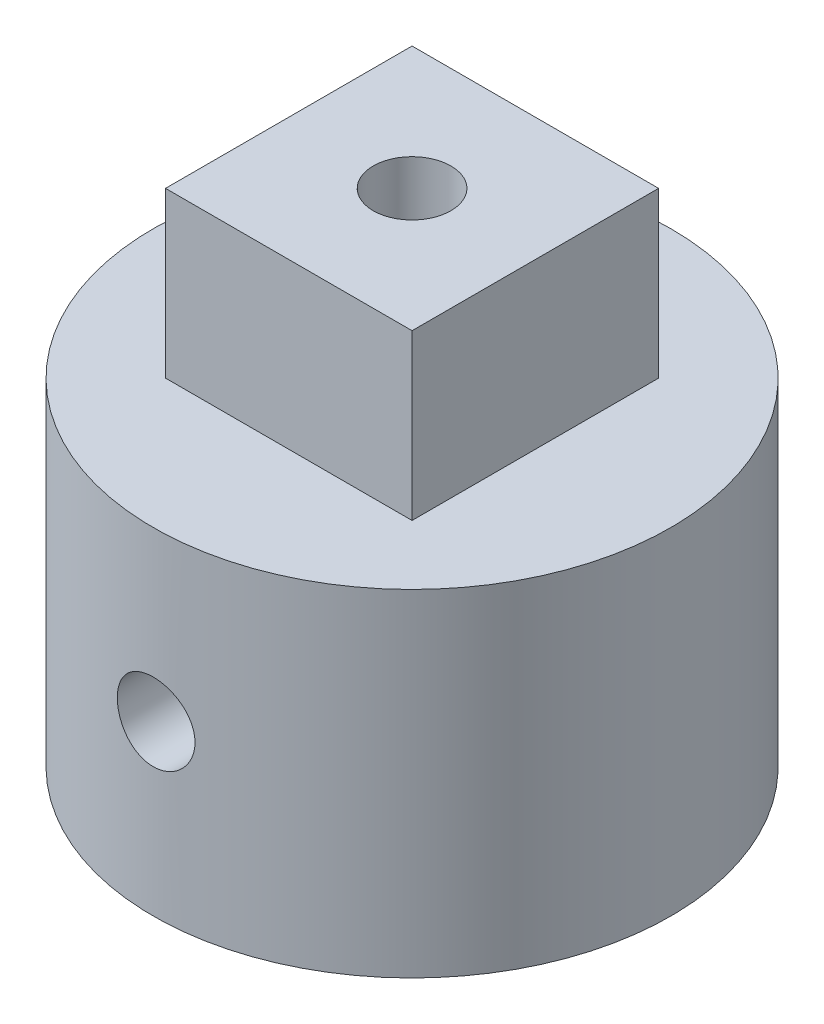
ISO-10303-21;
HEADER;
FILE_DESCRIPTION(('STEP AP214'),'2;1');
FILE_NAME('part.step','',(''),(''),'','','');
FILE_SCHEMA(('AUTOMOTIVE_DESIGN { 1 0 10303 214 1 1 1 1 }'));
ENDSEC;
DATA;
#1=APPLICATION_CONTEXT('core data for automotive mechanical design processes');
#2=APPLICATION_PROTOCOL_DEFINITION('international standard','automotive_design',2000,#1);
#3=PRODUCT_CONTEXT('',#1,'mechanical');
#4=PRODUCT('Part','Part','',(#3));
#5=PRODUCT_RELATED_PRODUCT_CATEGORY('part','',(#4));
#6=PRODUCT_DEFINITION_FORMATION('','',#4);
#7=PRODUCT_DEFINITION_CONTEXT('part definition',#1,'design');
#8=PRODUCT_DEFINITION('design','',#6,#7);
#9=PRODUCT_DEFINITION_SHAPE('','',#8);
#10=(LENGTH_UNIT() NAMED_UNIT(*) SI_UNIT(.MILLI.,.METRE.));
#11=(NAMED_UNIT(*) PLANE_ANGLE_UNIT() SI_UNIT($,.RADIAN.));
#12=(NAMED_UNIT(*) SI_UNIT($,.STERADIAN.) SOLID_ANGLE_UNIT());
#13=UNCERTAINTY_MEASURE_WITH_UNIT(LENGTH_MEASURE(1.E-05),#10,'distance_accuracy_value','');
#14=(GEOMETRIC_REPRESENTATION_CONTEXT(3) GLOBAL_UNCERTAINTY_ASSIGNED_CONTEXT((#13)) GLOBAL_UNIT_ASSIGNED_CONTEXT((#10,
#11,#12)) REPRESENTATION_CONTEXT('',''));
#15=CARTESIAN_POINT('',(0.,0.,0.));
#16=DIRECTION('',(0.,0.,1.));
#17=DIRECTION('',(1.,0.,0.));
#18=AXIS2_PLACEMENT_3D('',#15,#16,#17);
#19=CARTESIAN_POINT('',(0.,6.35,0.));
#20=DIRECTION('',(0.,-1.,0.));
#21=DIRECTION('',(0.,0.,-1.));
#22=AXIS2_PLACEMENT_3D('',#19,#20,#21);
#23=PLANE('',#22);
#24=DIRECTION('',(0.,0.,1.));
#25=VECTOR('',#24,1.);
#26=CARTESIAN_POINT('',(-4.7625,6.35,4.7625));
#27=LINE('',#26,#25);
#28=CARTESIAN_POINT('',(-4.7625,6.35,-4.7625));
#29=VERTEX_POINT('',#28);
#30=CARTESIAN_POINT('',(-4.7625,6.35,4.7625));
#31=VERTEX_POINT('',#30);
#32=EDGE_CURVE('E106',#29,#31,#27,.T.);
#33=ORIENTED_EDGE('',*,*,#32,.T.);
#34=DIRECTION('',(1.,0.,0.));
#35=VECTOR('',#34,1.);
#36=CARTESIAN_POINT('',(-4.7625,6.35,4.7625));
#37=LINE('',#36,#35);
#38=CARTESIAN_POINT('',(4.7625,6.35,4.7625));
#39=VERTEX_POINT('',#38);
#40=EDGE_CURVE('E90',#31,#39,#37,.T.);
#41=ORIENTED_EDGE('',*,*,#40,.T.);
#42=DIRECTION('',(0.,0.,-1.));
#43=VECTOR('',#42,1.);
#44=CARTESIAN_POINT('',(4.7625,6.35,4.7625));
#45=LINE('',#44,#43);
#46=CARTESIAN_POINT('',(4.7625,6.35,-4.7625));
#47=VERTEX_POINT('',#46);
#48=EDGE_CURVE('E268',#39,#47,#45,.T.);
#49=ORIENTED_EDGE('',*,*,#48,.T.);
#50=DIRECTION('',(-1.,0.,0.));
#51=VECTOR('',#50,1.);
#52=CARTESIAN_POINT('',(-4.7625,6.35,-4.7625));
#53=LINE('',#52,#51);
#54=EDGE_CURVE('E55',#47,#29,#53,.T.);
#55=ORIENTED_EDGE('',*,*,#54,.T.);
#56=EDGE_LOOP('',(#33,#41,#49,#55));
#57=FACE_BOUND('',#56,.T.);
#58=CARTESIAN_POINT('',(0.,6.35,0.));
#59=DIRECTION('',(0.,1.,0.));
#60=DIRECTION('',(0.,0.,1.));
#61=AXIS2_PLACEMENT_3D('',#58,#59,#60);
#62=CIRCLE('',#61,1.5);
#63=CARTESIAN_POINT('',(0.,6.35,1.5));
#64=VERTEX_POINT('',#63);
#65=EDGE_CURVE('E95',#64,#64,#62,.T.);
#66=ORIENTED_EDGE('',*,*,#65,.F.);
#67=EDGE_LOOP('',(#66));
#68=FACE_BOUND('',#67,.T.);
#69=ADVANCED_FACE('F33',(#57,#68),#23,.F.);
#70=CARTESIAN_POINT('',(-4.7625,6.35,4.7625));
#71=DIRECTION('',(1.,0.,0.));
#72=DIRECTION('',(0.,0.,-1.));
#73=AXIS2_PLACEMENT_3D('',#70,#71,#72);
#74=PLANE('',#73);
#75=DIRECTION('',(0.,0.,1.));
#76=VECTOR('',#75,1.);
#77=CARTESIAN_POINT('',(-4.7625,0.,4.7625));
#78=LINE('',#77,#76);
#79=CARTESIAN_POINT('',(-4.7625,0.,-4.7625));
#80=VERTEX_POINT('',#79);
#81=CARTESIAN_POINT('',(-4.7625,0.,4.7625));
#82=VERTEX_POINT('',#81);
#83=EDGE_CURVE('E80',#80,#82,#78,.T.);
#84=ORIENTED_EDGE('',*,*,#83,.T.);
#85=DIRECTION('',(0.,-1.,0.));
#86=VECTOR('',#85,1.);
#87=CARTESIAN_POINT('',(-4.7625,6.35,4.7625));
#88=LINE('',#87,#86);
#89=EDGE_CURVE('E11',#31,#82,#88,.T.);
#90=ORIENTED_EDGE('',*,*,#89,.F.);
#91=ORIENTED_EDGE('',*,*,#32,.F.);
#92=DIRECTION('',(0.,-1.,0.));
#93=VECTOR('',#92,1.);
#94=CARTESIAN_POINT('',(-4.7625,6.35,-4.7625));
#95=LINE('',#94,#93);
#96=EDGE_CURVE('E94',#29,#80,#95,.T.);
#97=ORIENTED_EDGE('',*,*,#96,.T.);
#98=EDGE_LOOP('',(#84,#90,#91,#97));
#99=FACE_BOUND('',#98,.T.);
#100=ADVANCED_FACE('F35',(#99),#74,.F.);
#101=CARTESIAN_POINT('',(-4.7625,6.35,4.7625));
#102=DIRECTION('',(0.,0.,-1.));
#103=DIRECTION('',(-1.,0.,0.));
#104=AXIS2_PLACEMENT_3D('',#101,#102,#103);
#105=PLANE('',#104);
#106=DIRECTION('',(1.,0.,0.));
#107=VECTOR('',#106,1.);
#108=CARTESIAN_POINT('',(-4.7625,0.,4.7625));
#109=LINE('',#108,#107);
#110=CARTESIAN_POINT('',(4.7625,0.,4.7625));
#111=VERTEX_POINT('',#110);
#112=EDGE_CURVE('E76',#82,#111,#109,.T.);
#113=ORIENTED_EDGE('',*,*,#112,.T.);
#114=DIRECTION('',(0.,-1.,0.));
#115=VECTOR('',#114,1.);
#116=CARTESIAN_POINT('',(4.7625,6.35,4.7625));
#117=LINE('',#116,#115);
#118=EDGE_CURVE('E47',#39,#111,#117,.T.);
#119=ORIENTED_EDGE('',*,*,#118,.F.);
#120=ORIENTED_EDGE('',*,*,#40,.F.);
#121=ORIENTED_EDGE('',*,*,#89,.T.);
#122=EDGE_LOOP('',(#113,#119,#120,#121));
#123=FACE_BOUND('',#122,.T.);
#124=ADVANCED_FACE('F89',(#123),#105,.F.);
#125=CARTESIAN_POINT('',(4.7625,6.35,4.7625));
#126=DIRECTION('',(-1.,0.,0.));
#127=DIRECTION('',(0.,0.,1.));
#128=AXIS2_PLACEMENT_3D('',#125,#126,#127);
#129=PLANE('',#128);
#130=DIRECTION('',(0.,0.,-1.));
#131=VECTOR('',#130,1.);
#132=CARTESIAN_POINT('',(4.7625,0.,4.7625));
#133=LINE('',#132,#131);
#134=CARTESIAN_POINT('',(4.7625,0.,-4.7625));
#135=VERTEX_POINT('',#134);
#136=EDGE_CURVE('E83',#111,#135,#133,.T.);
#137=ORIENTED_EDGE('',*,*,#136,.T.);
#138=DIRECTION('',(0.,-1.,0.));
#139=VECTOR('',#138,1.);
#140=CARTESIAN_POINT('',(4.7625,6.35,-4.7625));
#141=LINE('',#140,#139);
#142=EDGE_CURVE('E108',#47,#135,#141,.T.);
#143=ORIENTED_EDGE('',*,*,#142,.F.);
#144=ORIENTED_EDGE('',*,*,#48,.F.);
#145=ORIENTED_EDGE('',*,*,#118,.T.);
#146=EDGE_LOOP('',(#137,#143,#144,#145));
#147=FACE_BOUND('',#146,.T.);
#148=ADVANCED_FACE('F157',(#147),#129,.F.);
#149=CARTESIAN_POINT('',(-4.7625,6.35,-4.7625));
#150=DIRECTION('',(0.,0.,1.));
#151=DIRECTION('',(1.,0.,0.));
#152=AXIS2_PLACEMENT_3D('',#149,#150,#151);
#153=PLANE('',#152);
#154=DIRECTION('',(-1.,0.,0.));
#155=VECTOR('',#154,1.);
#156=CARTESIAN_POINT('',(-4.7625,0.,-4.7625));
#157=LINE('',#156,#155);
#158=EDGE_CURVE('E104',#135,#80,#157,.T.);
#159=ORIENTED_EDGE('',*,*,#158,.T.);
#160=ORIENTED_EDGE('',*,*,#96,.F.);
#161=ORIENTED_EDGE('',*,*,#54,.F.);
#162=ORIENTED_EDGE('',*,*,#142,.T.);
#163=EDGE_LOOP('',(#159,#160,#161,#162));
#164=FACE_BOUND('',#163,.T.);
#165=ADVANCED_FACE('F151',(#164),#153,.F.);
#166=CARTESIAN_POINT('',(0.,6.35,0.));
#167=DIRECTION('',(0.,-1.,0.));
#168=DIRECTION('',(0.,0.,-1.));
#169=AXIS2_PLACEMENT_3D('',#166,#167,#168);
#170=CYLINDRICAL_SURFACE('',#169,1.5);
#171=ORIENTED_EDGE('',*,*,#65,.T.);
#172=EDGE_LOOP('',(#171));
#173=FACE_BOUND('',#172,.T.);
#174=CARTESIAN_POINT('',(0.,0.,0.));
#175=DIRECTION('',(0.,1.,0.));
#176=DIRECTION('',(0.,0.,1.));
#177=AXIS2_PLACEMENT_3D('',#174,#175,#176);
#178=CIRCLE('',#177,1.5);
#179=CARTESIAN_POINT('',(0.,0.,1.5));
#180=VERTEX_POINT('',#179);
#181=EDGE_CURVE('E98',#180,#180,#178,.T.);
#182=ORIENTED_EDGE('',*,*,#181,.F.);
#183=EDGE_LOOP('',(#182));
#184=FACE_BOUND('',#183,.T.);
#185=ADVANCED_FACE('F147',(#173,#184),#170,.F.);
#186=CARTESIAN_POINT('',(0.,0.,0.));
#187=DIRECTION('',(0.,-1.,0.));
#188=DIRECTION('',(0.,0.,-1.));
#189=AXIS2_PLACEMENT_3D('',#186,#187,#188);
#190=PLANE('',#189);
#191=ORIENTED_EDGE('',*,*,#181,.T.);
#192=EDGE_LOOP('',(#191));
#193=FACE_BOUND('',#192,.T.);
#194=ADVANCED_FACE('F145',(#193),#190,.F.);
#195=CARTESIAN_POINT('',(0.,-13.,0.));
#196=DIRECTION('',(0.,1.,0.));
#197=DIRECTION('',(0.,0.,1.));
#198=AXIS2_PLACEMENT_3D('',#195,#196,#197);
#199=CYLINDRICAL_SURFACE('',#198,10.);
#200=CARTESIAN_POINT('',(0.,-5.,-10.));
#201=CARTESIAN_POINT('',(-0.0837515444816421,-5.00000345381524,-9.99999865771297));
#202=CARTESIAN_POINT('',(-0.167551685082132,-5.00703800084063,-9.9989368253704));
#203=CARTESIAN_POINT('',(-0.332809627994913,-5.03498319998275,-9.99480315973187));
#204=CARTESIAN_POINT('',(-0.414265068974229,-5.05590736294489,-9.99172936938473));
#205=CARTESIAN_POINT('',(-0.57241808622186,-5.11099250496762,-9.98391721219526));
#206=CARTESIAN_POINT('',(-0.649119207826799,-5.14514347950595,-9.97918010370919));
#207=CARTESIAN_POINT('',(-0.795690428635254,-5.22568837941686,-9.96856475911724));
#208=CARTESIAN_POINT('',(-0.865561474725189,-5.27208060441736,-9.96268668152773));
#209=CARTESIAN_POINT('',(-0.997046719562126,-5.37617726493987,-9.95039170991452));
#210=CARTESIAN_POINT('',(-1.0585998322255,-5.43395845620821,-9.94397133890331));
#211=CARTESIAN_POINT('',(-1.17117490668949,-5.55902768889387,-9.93134261133238));
#212=CARTESIAN_POINT('',(-1.22219626272936,-5.62631627677852,-9.92513426698505));
#213=CARTESIAN_POINT('',(-1.31249729499943,-5.76890064352249,-9.91359877458726));
#214=CARTESIAN_POINT('',(-1.35171787037205,-5.84423424698134,-9.90827611975031));
#215=CARTESIAN_POINT('',(-1.41692632171056,-6.00051282064543,-9.89916211306268));
#216=CARTESIAN_POINT('',(-1.44291491889163,-6.08145748474389,-9.89537067775449));
#217=CARTESIAN_POINT('',(-1.48073198798911,-6.24601804187172,-9.88978256218673));
#218=CARTESIAN_POINT('',(-1.49266503640518,-6.32960939340802,-9.8879711574125));
#219=CARTESIAN_POINT('',(-1.50235624033932,-6.49762616598728,-9.88650348970582));
#220=CARTESIAN_POINT('',(-1.50011520973796,-6.58205153886249,-9.88684710303147));
#221=CARTESIAN_POINT('',(-1.48160733250787,-6.74860108019414,-9.88963718352409));
#222=CARTESIAN_POINT('',(-1.4654569592775,-6.8307385264848,-9.89206618761549));
#223=CARTESIAN_POINT('',(-1.41977117403734,-6.99112436887153,-9.89872608126367));
#224=CARTESIAN_POINT('',(-1.39023538337812,-7.06937265488074,-9.90295702179379));
#225=CARTESIAN_POINT('',(-1.31849603529736,-7.22011337128286,-9.91276335545481));
#226=CARTESIAN_POINT('',(-1.27624314283198,-7.29258196909239,-9.91834396766526));
#227=CARTESIAN_POINT('',(-1.18030413128955,-7.42944459578193,-9.93021707574548));
#228=CARTESIAN_POINT('',(-1.12661726182478,-7.49383809426937,-9.93650961832501));
#229=CARTESIAN_POINT('',(-1.00869493078248,-7.61339766073972,-9.94917473056209));
#230=CARTESIAN_POINT('',(-0.944359329642001,-7.66846499028634,-9.95554747112815));
#231=CARTESIAN_POINT('',(-0.807307089894185,-7.76703593450726,-9.96759647648462));
#232=CARTESIAN_POINT('',(-0.734590414588169,-7.8105394985439,-9.9732727382251));
#233=CARTESIAN_POINT('',(-0.582754598213685,-7.88475308649955,-9.98329515585393));
#234=CARTESIAN_POINT('',(-0.503631677836778,-7.9154554918403,-9.98764051925428));
#235=CARTESIAN_POINT('',(-0.341273182487058,-7.96310938968538,-9.99450490557069));
#236=CARTESIAN_POINT('',(-0.258037885952598,-7.98006181181558,-9.99702405195467));
#237=CARTESIAN_POINT('',(-0.090669567643644,-7.9996032298167,-9.99993581133871));
#238=CARTESIAN_POINT('',(-0.00655273187046784,-8.00232797137932,-10.0003485209039));
#239=CARTESIAN_POINT('',(0.160936677662285,-7.99369699468898,-9.99905561015226));
#240=CARTESIAN_POINT('',(0.244309274381879,-7.9823417123319,-9.99735005541369));
#241=CARTESIAN_POINT('',(0.407532387431411,-7.94598589982246,-9.99202468615333));
#242=CARTESIAN_POINT('',(0.487397963079841,-7.92105150396915,-9.98841415207984));
#243=CARTESIAN_POINT('',(0.641814958643002,-7.85831500253824,-9.97968235658369));
#244=CARTESIAN_POINT('',(0.716366128795103,-7.82051229266637,-9.97456102421565));
#245=CARTESIAN_POINT('',(0.858634979291923,-7.73279377543614,-9.96332682468686));
#246=CARTESIAN_POINT('',(0.926299009891568,-7.68279185998723,-9.95720701626745));
#247=CARTESIAN_POINT('',(1.05232367317771,-7.57221418837125,-9.94467863012165));
#248=CARTESIAN_POINT('',(1.11068376479341,-7.51163781767535,-9.93827003562867));
#249=CARTESIAN_POINT('',(1.21693784957196,-7.38102646682351,-9.92582264304494));
#250=CARTESIAN_POINT('',(1.26474084747421,-7.31091707480523,-9.91978736017588));
#251=CARTESIAN_POINT('',(1.34789129270584,-7.16358395948823,-9.90883219104903));
#252=CARTESIAN_POINT('',(1.38323907656436,-7.08636042847853,-9.90391227465628));
#253=CARTESIAN_POINT('',(1.44033467323944,-6.92726246637687,-9.89577033008645));
#254=CARTESIAN_POINT('',(1.46213037141636,-6.84540553902875,-9.89254233006438));
#255=CARTESIAN_POINT('',(1.49165549501587,-6.67914098456489,-9.88813382297802));
#256=CARTESIAN_POINT('',(1.49938589183067,-6.59473353400532,-9.88695317451771));
#257=CARTESIAN_POINT('',(1.5005378666944,-6.42667093668422,-9.88677832610841));
#258=CARTESIAN_POINT('',(1.49410252167313,-6.34301675824307,-9.88776226333502));
#259=CARTESIAN_POINT('',(1.46741229544379,-6.17799473667648,-9.89175820611174));
#260=CARTESIAN_POINT('',(1.44715743638627,-6.0966268898866,-9.89477020841118));
#261=CARTESIAN_POINT('',(1.39345373518665,-5.93852691776567,-9.90247526112297));
#262=CARTESIAN_POINT('',(1.36001489324314,-5.86179132956656,-9.90716703716075));
#263=CARTESIAN_POINT('',(1.28090667642309,-5.7149963661976,-9.91770454557702));
#264=CARTESIAN_POINT('',(1.23523688741502,-5.64493721719635,-9.92355031702724));
#265=CARTESIAN_POINT('',(1.13244337659164,-5.51275694202483,-9.93580743364938));
#266=CARTESIAN_POINT('',(1.07521369039806,-5.45071866675293,-9.94222367881967));
#267=CARTESIAN_POINT('',(0.951148841082834,-5.33707544521217,-9.95485788826636));
#268=CARTESIAN_POINT('',(0.884311448350941,-5.28547292742384,-9.96107580610759));
#269=CARTESIAN_POINT('',(0.742495707543722,-5.19391232339263,-9.9726518579052));
#270=CARTESIAN_POINT('',(0.66747457676476,-5.15401989078525,-9.9780050712882));
#271=CARTESIAN_POINT('',(0.511751870248719,-5.08746148324195,-9.98720028802959));
#272=CARTESIAN_POINT('',(0.431056277096704,-5.06078180994631,-9.99104385565757));
#273=CARTESIAN_POINT('',(0.291665727889329,-5.02745865728989,-9.99590939261505));
#274=CARTESIAN_POINT('',(0.233831133495278,-5.01717739846119,-9.99743549179557));
#275=CARTESIAN_POINT('',(0.117338971600125,-5.00344690228736,-9.99948125947896));
#276=CARTESIAN_POINT('',(0.0586814143344172,-4.99999758004745,-10.0000009404877));
#277=CARTESIAN_POINT('',(0.,-5.,-10.));
#278=B_SPLINE_CURVE_WITH_KNOTS('',3,(#200,#201,#202,#203,#204,#205,#206,#207,#208,#209,#210,
#211,#212,#213,#214,#215,#216,#217,#218,#219,#220,#221,#222,#223,#224,#225,#226,#227,#228,#229,
#230,#231,#232,#233,#234,#235,#236,#237,#238,#239,#240,#241,#242,#243,#244,#245,#246,#247,#248,
#249,#250,#251,#252,#253,#254,#255,#256,#257,#258,#259,#260,#261,#262,#263,#264,#265,#266,#267,
#268,#269,#270,#271,#272,#273,#274,#275,#276,#277),.UNSPECIFIED.,.T.,.F.,(4,2,2,2,2,2,2,2,2,2,2,
2,2,2,2,2,2,2,2,2,2,2,2,2,2,2,2,2,2,2,2,2,2,2,2,2,2,2,4),(0.,0.251040205031663,0.50232496292915,
0.753420023583237,1.0044802241976,1.25729416136843,1.5101226357258,1.76419702395375,
2.01825756225506,2.27041564605924,2.52255925098982,2.77261177195746,3.02267136690361,
3.27371383476159,3.52477278308534,3.77834291255409,4.03191415238668,4.28563608984875,
4.53934087193401,4.79062058544255,5.04189251991155,5.29195148965948,5.54202220376274,
5.79391188036908,6.0458162002863,6.29981366584672,6.55380426808833,6.80689223457169,
7.05996272137177,7.31048888261065,7.56101464229564,7.81135073984147,8.0616953146688,
8.31444829965721,8.56726003468733,8.82146323384734,9.07540233261442,9.25129851978809,
9.42719252123291),.UNSPECIFIED.);
#279=CARTESIAN_POINT('',(0.,-5.,-10.));
#280=VERTEX_POINT('',#279);
#281=EDGE_CURVE('E130',#280,#280,#278,.T.);
#282=ORIENTED_EDGE('',*,*,#281,.T.);
#283=EDGE_LOOP('',(#282));
#284=FACE_BOUND('',#283,.T.);
#285=CARTESIAN_POINT('',(0.,-8.,10.));
#286=CARTESIAN_POINT('',(-0.0837515444816422,-7.99999654618476,9.99999865771297));
#287=CARTESIAN_POINT('',(-0.167551685082132,-7.99296199915937,9.9989368253704));
#288=CARTESIAN_POINT('',(-0.332809627994913,-7.96501680001725,9.99480315973187));
#289=CARTESIAN_POINT('',(-0.414265068974229,-7.94409263705511,9.99172936938473));
#290=CARTESIAN_POINT('',(-0.57241808622186,-7.88900749503237,9.98391721219526));
#291=CARTESIAN_POINT('',(-0.649119207826799,-7.85485652049405,9.97918010370919));
#292=CARTESIAN_POINT('',(-0.795690428635254,-7.77431162058314,9.96856475911724));
#293=CARTESIAN_POINT('',(-0.865561474725189,-7.72791939558264,9.96268668152773));
#294=CARTESIAN_POINT('',(-0.997046719562126,-7.62382273506013,9.95039170991452));
#295=CARTESIAN_POINT('',(-1.0585998322255,-7.56604154379179,9.94397133890331));
#296=CARTESIAN_POINT('',(-1.17117490668948,-7.44097231110613,9.93134261133238));
#297=CARTESIAN_POINT('',(-1.22219626272936,-7.37368372322148,9.92513426698505));
#298=CARTESIAN_POINT('',(-1.31249729499943,-7.23109935647751,9.91359877458726));
#299=CARTESIAN_POINT('',(-1.35171787037205,-7.15576575301866,9.90827611975031));
#300=CARTESIAN_POINT('',(-1.41692632171056,-6.99948717935457,9.89916211306268));
#301=CARTESIAN_POINT('',(-1.44291491889163,-6.91854251525611,9.89537067775449));
#302=CARTESIAN_POINT('',(-1.48073198798911,-6.75398195812828,9.88978256218673));
#303=CARTESIAN_POINT('',(-1.49266503640518,-6.67039060659198,9.8879711574125));
#304=CARTESIAN_POINT('',(-1.50235624033932,-6.50237383401272,9.88650348970582));
#305=CARTESIAN_POINT('',(-1.50011520973796,-6.41794846113751,9.88684710303147));
#306=CARTESIAN_POINT('',(-1.48160733250787,-6.25139891980586,9.88963718352409));
#307=CARTESIAN_POINT('',(-1.4654569592775,-6.1692614735152,9.89206618761549));
#308=CARTESIAN_POINT('',(-1.41977117403734,-6.00887563112847,9.89872608126367));
#309=CARTESIAN_POINT('',(-1.39023538337812,-5.93062734511925,9.90295702179379));
#310=CARTESIAN_POINT('',(-1.31849603529736,-5.77988662871714,9.91276335545481));
#311=CARTESIAN_POINT('',(-1.27624314283198,-5.70741803090761,9.91834396766526));
#312=CARTESIAN_POINT('',(-1.18030413128955,-5.57055540421807,9.93021707574548));
#313=CARTESIAN_POINT('',(-1.12661726182478,-5.50616190573063,9.93650961832501));
#314=CARTESIAN_POINT('',(-1.00869493078248,-5.38660233926028,9.94917473056209));
#315=CARTESIAN_POINT('',(-0.944359329642001,-5.33153500971366,9.95554747112815));
#316=CARTESIAN_POINT('',(-0.807307089894186,-5.23296406549274,9.96759647648462));
#317=CARTESIAN_POINT('',(-0.73459041458817,-5.1894605014561,9.9732727382251));
#318=CARTESIAN_POINT('',(-0.582754598213685,-5.11524691350045,9.98329515585393));
#319=CARTESIAN_POINT('',(-0.503631677836779,-5.0845445081597,9.98764051925428));
#320=CARTESIAN_POINT('',(-0.341273182487059,-5.03689061031463,9.99450490557069));
#321=CARTESIAN_POINT('',(-0.258037885952599,-5.01993818818442,9.99702405195467));
#322=CARTESIAN_POINT('',(-0.0906695676436446,-5.0003967701833,9.99993581133871));
#323=CARTESIAN_POINT('',(-0.00655273187046838,-4.99767202862068,10.0003485209039));
#324=CARTESIAN_POINT('',(0.160936677662285,-5.00630300531102,9.99905561015226));
#325=CARTESIAN_POINT('',(0.244309274381879,-5.0176582876681,9.99735005541368));
#326=CARTESIAN_POINT('',(0.40753238743141,-5.05401410017754,9.99202468615333));
#327=CARTESIAN_POINT('',(0.48739796307984,-5.07894849603084,9.98841415207984));
#328=CARTESIAN_POINT('',(0.641814958643001,-5.14168499746176,9.97968235658369));
#329=CARTESIAN_POINT('',(0.716366128795101,-5.17948770733363,9.97456102421565));
#330=CARTESIAN_POINT('',(0.858634979291923,-5.26720622456386,9.96332682468686));
#331=CARTESIAN_POINT('',(0.926299009891568,-5.31720814001277,9.95720701626745));
#332=CARTESIAN_POINT('',(1.05232367317771,-5.42778581162875,9.94467863012165));
#333=CARTESIAN_POINT('',(1.1106837647934,-5.48836218232465,9.93827003562867));
#334=CARTESIAN_POINT('',(1.21693784957196,-5.61897353317649,9.92582264304494));
#335=CARTESIAN_POINT('',(1.26474084747421,-5.68908292519477,9.91978736017588));
#336=CARTESIAN_POINT('',(1.34789129270584,-5.83641604051177,9.90883219104903));
#337=CARTESIAN_POINT('',(1.38323907656436,-5.91363957152147,9.90391227465628));
#338=CARTESIAN_POINT('',(1.44033467323944,-6.07273753362313,9.89577033008645));
#339=CARTESIAN_POINT('',(1.46213037141636,-6.15459446097124,9.89254233006438));
#340=CARTESIAN_POINT('',(1.49165549501587,-6.32085901543511,9.88813382297802));
#341=CARTESIAN_POINT('',(1.49938589183067,-6.40526646599468,9.88695317451771));
#342=CARTESIAN_POINT('',(1.5005378666944,-6.57332906331578,9.88677832610841));
#343=CARTESIAN_POINT('',(1.49410252167313,-6.65698324175692,9.88776226333502));
#344=CARTESIAN_POINT('',(1.46741229544379,-6.82200526332352,9.89175820611174));
#345=CARTESIAN_POINT('',(1.44715743638627,-6.90337311011339,9.89477020841117));
#346=CARTESIAN_POINT('',(1.39345373518665,-7.06147308223432,9.90247526112297));
#347=CARTESIAN_POINT('',(1.36001489324314,-7.13820867043344,9.90716703716075));
#348=CARTESIAN_POINT('',(1.28090667642309,-7.2850036338024,9.91770454557702));
#349=CARTESIAN_POINT('',(1.23523688741502,-7.35506278280364,9.92355031702724));
#350=CARTESIAN_POINT('',(1.13244337659164,-7.48724305797517,9.93580743364938));
#351=CARTESIAN_POINT('',(1.07521369039806,-7.54928133324707,9.94222367881967));
#352=CARTESIAN_POINT('',(0.951148841082836,-7.66292455478782,9.95485788826636));
#353=CARTESIAN_POINT('',(0.884311448350942,-7.71452707257616,9.96107580610759));
#354=CARTESIAN_POINT('',(0.742495707543722,-7.80608767660736,9.9726518579052));
#355=CARTESIAN_POINT('',(0.667474576764761,-7.84598010921475,9.9780050712882));
#356=CARTESIAN_POINT('',(0.51175187024872,-7.91253851675804,9.98720028802959));
#357=CARTESIAN_POINT('',(0.431056277096705,-7.93921819005369,9.99104385565757));
#358=CARTESIAN_POINT('',(0.29166572788933,-7.97254134271011,9.99590939261505));
#359=CARTESIAN_POINT('',(0.233831133495279,-7.98282260153881,9.99743549179557));
#360=CARTESIAN_POINT('',(0.117338971600125,-7.99655309771264,9.99948125947896));
#361=CARTESIAN_POINT('',(0.0586814143344171,-8.00000241995255,10.0000009404877));
#362=CARTESIAN_POINT('',(0.,-8.,10.));
#363=B_SPLINE_CURVE_WITH_KNOTS('',3,(#285,#286,#287,#288,#289,#290,#291,#292,#293,#294,#295,
#296,#297,#298,#299,#300,#301,#302,#303,#304,#305,#306,#307,#308,#309,#310,#311,#312,#313,#314,
#315,#316,#317,#318,#319,#320,#321,#322,#323,#324,#325,#326,#327,#328,#329,#330,#331,#332,#333,
#334,#335,#336,#337,#338,#339,#340,#341,#342,#343,#344,#345,#346,#347,#348,#349,#350,#351,#352,
#353,#354,#355,#356,#357,#358,#359,#360,#361,#362),.UNSPECIFIED.,.T.,.F.,(4,2,2,2,2,2,2,2,2,2,2,
2,2,2,2,2,2,2,2,2,2,2,2,2,2,2,2,2,2,2,2,2,2,2,2,2,2,2,4),(0.,0.251040205031663,
0.502324962929151,0.753420023583238,1.0044802241976,1.25729416136843,1.5101226357258,
1.76419702395375,2.01825756225506,2.27041564605924,2.52255925098982,2.77261177195746,
3.02267136690361,3.27371383476159,3.52477278308534,3.77834291255409,4.03191415238668,
4.28563608984874,4.53934087193401,4.79062058544255,5.04189251991155,5.29195148965948,
5.54202220376274,5.79391188036908,6.0458162002863,6.29981366584672,6.55380426808832,
6.80689223457168,7.05996272137177,7.31048888261064,7.56101464229564,7.81135073984147,
8.0616953146688,8.31444829965721,8.56726003468733,8.82146323384734,9.07540233261442,
9.25129851978809,9.42719252123291),.UNSPECIFIED.);
#364=CARTESIAN_POINT('',(0.,-8.,10.));
#365=VERTEX_POINT('',#364);
#366=EDGE_CURVE('E135',#365,#365,#363,.T.);
#367=ORIENTED_EDGE('',*,*,#366,.T.);
#368=EDGE_LOOP('',(#367));
#369=FACE_BOUND('',#368,.T.);
#370=CARTESIAN_POINT('',(0.,-13.,0.));
#371=DIRECTION('',(0.,-1.,0.));
#372=DIRECTION('',(0.,0.,-1.));
#373=AXIS2_PLACEMENT_3D('',#370,#371,#372);
#374=CIRCLE('',#373,10.);
#375=CARTESIAN_POINT('',(0.,-13.,-10.));
#376=VERTEX_POINT('',#375);
#377=EDGE_CURVE('E254',#376,#376,#374,.T.);
#378=ORIENTED_EDGE('',*,*,#377,.F.);
#379=EDGE_LOOP('',(#378));
#380=FACE_BOUND('',#379,.T.);
#381=CARTESIAN_POINT('',(0.,0.,0.));
#382=DIRECTION('',(0.,-1.,0.));
#383=DIRECTION('',(0.,0.,-1.));
#384=AXIS2_PLACEMENT_3D('',#381,#382,#383);
#385=CIRCLE('',#384,10.);
#386=CARTESIAN_POINT('',(0.,0.,-10.));
#387=VERTEX_POINT('',#386);
#388=EDGE_CURVE('E257',#387,#387,#385,.T.);
#389=ORIENTED_EDGE('',*,*,#388,.T.);
#390=EDGE_LOOP('',(#389));
#391=FACE_BOUND('',#390,.T.);
#392=ADVANCED_FACE('F139',(#284,#369,#380,#391),#199,.T.);
#393=CARTESIAN_POINT('',(0.,-13.,0.));
#394=DIRECTION('',(0.,-1.,0.));
#395=DIRECTION('',(0.,0.,-1.));
#396=AXIS2_PLACEMENT_3D('',#393,#394,#395);
#397=PLANE('',#396);
#398=CARTESIAN_POINT('',(0.,-13.,0.));
#399=DIRECTION('',(0.,-1.,0.));
#400=DIRECTION('',(0.,0.,-1.));
#401=AXIS2_PLACEMENT_3D('',#398,#399,#400);
#402=CIRCLE('',#401,1.55);
#403=CARTESIAN_POINT('',(0.,-13.,-1.55));
#404=VERTEX_POINT('',#403);
#405=EDGE_CURVE('E262',#404,#404,#402,.T.);
#406=ORIENTED_EDGE('',*,*,#405,.F.);
#407=EDGE_LOOP('',(#406));
#408=FACE_BOUND('',#407,.T.);
#409=ORIENTED_EDGE('',*,*,#377,.T.);
#410=EDGE_LOOP('',(#409));
#411=FACE_BOUND('',#410,.T.);
#412=ADVANCED_FACE('F144',(#408,#411),#397,.T.);
#413=ORIENTED_EDGE('',*,*,#83,.F.);
#414=ORIENTED_EDGE('',*,*,#158,.F.);
#415=ORIENTED_EDGE('',*,*,#136,.F.);
#416=ORIENTED_EDGE('',*,*,#112,.F.);
#417=EDGE_LOOP('',(#413,#414,#415,#416));
#418=FACE_BOUND('',#417,.T.);
#419=ORIENTED_EDGE('',*,*,#388,.F.);
#420=EDGE_LOOP('',(#419));
#421=FACE_BOUND('',#420,.T.);
#422=ADVANCED_FACE('F77',(#418,#421),#190,.F.);
#423=CARTESIAN_POINT('',(0.,-2.,0.));
#424=DIRECTION('',(0.,-1.,0.));
#425=DIRECTION('',(0.,0.,-1.));
#426=AXIS2_PLACEMENT_3D('',#423,#424,#425);
#427=CYLINDRICAL_SURFACE('',#426,1.55);
#428=CARTESIAN_POINT('',(0.,-5.,-1.55));
#429=CARTESIAN_POINT('',(0.0676355330274348,-5.00000923631241,-1.54999081843046));
#430=CARTESIAN_POINT('',(0.135385038064903,-5.00462037293084,-1.54552730815956));
#431=CARTESIAN_POINT('',(0.268656128092146,-5.02271232440576,-1.52802940917958));
#432=CARTESIAN_POINT('',(0.334170585245085,-5.03621914983451,-1.51496988620329));
#433=CARTESIAN_POINT('',(0.460531661005092,-5.07095376198101,-1.48143605448111));
#434=CARTESIAN_POINT('',(0.521408709249813,-5.09212479487793,-1.46101625363012));
#435=CARTESIAN_POINT('',(0.63788889208984,-5.14092217538052,-1.41405401872415));
#436=CARTESIAN_POINT('',(0.693492939511153,-5.16854740280145,-1.38751264713421));
#437=CARTESIAN_POINT('',(0.820581634788787,-5.24143387455275,-1.31770149581901));
#438=CARTESIAN_POINT('',(0.88925641215993,-5.28928648135122,-1.27203025962067));
#439=CARTESIAN_POINT('',(1.01520576989899,-5.3927350980075,-1.17399180153673));
#440=CARTESIAN_POINT('',(1.07244587684376,-5.44835368939543,-1.12160509050306));
#441=CARTESIAN_POINT('',(1.15905645809111,-5.54639272054253,-1.03036877243889));
#442=CARTESIAN_POINT('',(1.19144642006318,-5.58724718970326,-0.992635667006654));
#443=CARTESIAN_POINT('',(1.25138700905586,-5.67132671585276,-0.915914787426986));
#444=CARTESIAN_POINT('',(1.27893455042558,-5.71455326150726,-0.876926231875601));
#445=CARTESIAN_POINT('',(1.32929209619449,-5.80316681779822,-0.798530053193023));
#446=CARTESIAN_POINT('',(1.35210921725435,-5.84855045487485,-0.759123154727602));
#447=CARTESIAN_POINT('',(1.393168512786,-5.94171809874191,-0.68082483303168));
#448=CARTESIAN_POINT('',(1.41141486057361,-5.98949986772287,-0.641932970513512));
#449=CARTESIAN_POINT('',(1.43796585474672,-6.07170374770097,-0.579220247170034));
#450=CARTESIAN_POINT('',(1.44754930690894,-6.10520691718932,-0.554734187823027));
#451=CARTESIAN_POINT('',(1.46463329583353,-6.17424295541027,-0.507900505941639));
#452=CARTESIAN_POINT('',(1.4721343935952,-6.20977527436097,-0.485552308519334));
#453=CARTESIAN_POINT('',(1.48283152463227,-6.27223429469908,-0.451580002246387));
#454=CARTESIAN_POINT('',(1.48664094036618,-6.29840141144391,-0.438782056021786));
#455=CARTESIAN_POINT('',(1.4929607756499,-6.35235133739796,-0.416772507905549));
#456=CARTESIAN_POINT('',(1.49547530893552,-6.38012871409657,-0.407549571880431));
#457=CARTESIAN_POINT('',(1.49854011071256,-6.43035112943046,-0.396112814231927));
#458=CARTESIAN_POINT('',(1.49941413846041,-6.45250508240597,-0.392757694838758));
#459=CARTESIAN_POINT('',(1.50016193526527,-6.49706295639663,-0.389893808440603));
#460=CARTESIAN_POINT('',(1.50003712302609,-6.51946647775493,-0.390379586000368));
#461=CARTESIAN_POINT('',(1.4988087528499,-6.56374051964912,-0.395065145411762));
#462=CARTESIAN_POINT('',(1.49770901081175,-6.58561277699402,-0.399250447051158));
#463=CARTESIAN_POINT('',(1.49463886434278,-6.6285231506924,-0.410597810421202));
#464=CARTESIAN_POINT('',(1.49266644232335,-6.64955921025295,-0.417766767909633));
#465=CARTESIAN_POINT('',(1.48421675577554,-6.72365798180155,-0.447289588755));
#466=CARTESIAN_POINT('',(1.4755864871079,-6.77400681899034,-0.475563845772818));
#467=CARTESIAN_POINT('',(1.45432019738923,-6.87070001300169,-0.537178739458943));
#468=CARTESIAN_POINT('',(1.44164953074072,-6.91700515103195,-0.570561845752363));
#469=CARTESIAN_POINT('',(1.41119167479362,-7.01106464763118,-0.642413158273158));
#470=CARTESIAN_POINT('',(1.39304229169765,-7.05856364542074,-0.681067117658293));
#471=CARTESIAN_POINT('',(1.3522289371783,-7.1511825589628,-0.758893263977797));
#472=CARTESIAN_POINT('',(1.32956049851528,-7.1963000642633,-0.798065927609309));
#473=CARTESIAN_POINT('',(1.27968080639221,-7.28419305029614,-0.875809766059654));
#474=CARTESIAN_POINT('',(1.25248535967425,-7.32697601528059,-0.914382540158556));
#475=CARTESIAN_POINT('',(1.1933570727096,-7.41022138268253,-0.990310294747434));
#476=CARTESIAN_POINT('',(1.16142733296676,-7.45068527999665,-1.02766605288113));
#477=CARTESIAN_POINT('',(1.07706051760184,-7.54674557237138,-1.11702184078188));
#478=CARTESIAN_POINT('',(1.02187542128093,-7.60092025676001,-1.16801390921706));
#479=CARTESIAN_POINT('',(0.900638243110883,-7.70210845619782,-1.26384571665306));
#480=CARTESIAN_POINT('',(0.834600360521077,-7.74913117576793,-1.30869335597762));
#481=CARTESIAN_POINT('',(0.70736474432969,-7.82432447255156,-1.38066834191322));
#482=CARTESIAN_POINT('',(0.648265804662634,-7.85436901934158,-1.40952616528862));
#483=CARTESIAN_POINT('',(0.524040425774721,-7.90709764053349,-1.46026443944318));
#484=CARTESIAN_POINT('',(0.458917640809063,-7.92978614019492,-1.48214908501786));
#485=CARTESIAN_POINT('',(0.323357261638128,-7.96642625354188,-1.5175252684446));
#486=CARTESIAN_POINT('',(0.252877834811486,-7.98029899450934,-1.53094103013228));
#487=CARTESIAN_POINT('',(0.109496119878127,-7.99773477723689,-1.54780630384202));
#488=CARTESIAN_POINT('',(0.0365960895639668,-8.00130716766464,-1.55126485309303));
#489=CARTESIAN_POINT('',(-0.0984919810263457,-7.99807077570085,-1.5481331430729));
#490=CARTESIAN_POINT('',(-0.160752682035299,-7.99264357327161,-1.54288022059812));
#491=CARTESIAN_POINT('',(-0.283103371878402,-7.9743400470884,-1.52517972072979));
#492=CARTESIAN_POINT('',(-0.343193125040603,-7.96146291715755,-1.51273136469899));
#493=CARTESIAN_POINT('',(-0.45988348607445,-7.92905052963417,-1.48144097259974));
#494=CARTESIAN_POINT('',(-0.516477558519089,-7.90950322161571,-1.46258736499715));
#495=CARTESIAN_POINT('',(-0.625185056628186,-7.86477262584326,-1.41953103602407));
#496=CARTESIAN_POINT('',(-0.677296955637226,-7.83958742823014,-1.39532650203913));
#497=CARTESIAN_POINT('',(-0.80114301695238,-7.77096788234546,-1.32955531942303));
#498=CARTESIAN_POINT('',(-0.869873446620261,-7.7246603802874,-1.28531444673555));
#499=CARTESIAN_POINT('',(-0.996221572518751,-7.62431589332919,-1.19010260703674));
#500=CARTESIAN_POINT('',(-1.05380501309096,-7.57025594356352,-1.1391116803163));
#501=CARTESIAN_POINT('',(-1.17684019417416,-7.43598313372513,-1.01377239339766));
#502=CARTESIAN_POINT('',(-1.23776700867064,-7.35332168415441,-0.937582193271948));
#503=CARTESIAN_POINT('',(-1.31518074653591,-7.22307629172385,-0.821565625582551));
#504=CARTESIAN_POINT('',(-1.33865419259973,-7.17862391890859,-0.782609044063352));
#505=CARTESIAN_POINT('',(-1.38111453148267,-7.08741639573558,-0.70495880575151));
#506=CARTESIAN_POINT('',(-1.40010488794505,-7.0406630570831,-0.666264968560315));
#507=CARTESIAN_POINT('',(-1.42865852656185,-6.95850086290446,-0.601900746736151));
#508=CARTESIAN_POINT('',(-1.43934747871828,-6.92383831429716,-0.575770422288701));
#509=CARTESIAN_POINT('',(-1.45846916957239,-6.85247262453873,-0.525437401582552));
#510=CARTESIAN_POINT('',(-1.46690169224685,-6.8157692884152,-0.501234890042072));
#511=CARTESIAN_POINT('',(-1.47915836826865,-6.75067792175218,-0.463531921663719));
#512=CARTESIAN_POINT('',(-1.48360817410217,-6.72303011650118,-0.448980349699609));
#513=CARTESIAN_POINT('',(-1.49107253782405,-6.66591035750205,-0.423530203157782));
#514=CARTESIAN_POINT('',(-1.4940916438818,-6.63644452548262,-0.412620085612804));
#515=CARTESIAN_POINT('',(-1.49778533654472,-6.58434296133269,-0.398968516937335));
#516=CARTESIAN_POINT('',(-1.49888133135799,-6.56212966787336,-0.394790034674023));
#517=CARTESIAN_POINT('',(-1.50006670712492,-6.51731006984792,-0.39026452270364));
#518=CARTESIAN_POINT('',(-1.50015818188905,-6.494704681172,-0.389909523400764));
#519=CARTESIAN_POINT('',(-1.49932930092276,-6.44984410921594,-0.393081437578552));
#520=CARTESIAN_POINT('',(-1.4984106800186,-6.42758839187338,-0.396601695367214));
#521=CARTESIAN_POINT('',(-1.49565869150687,-6.38386823273076,-0.406858697023164));
#522=CARTESIAN_POINT('',(-1.49382290141957,-6.36240604895085,-0.413603956910124));
#523=CARTESIAN_POINT('',(-1.48628457398181,-6.29143243946482,-0.440249186294603));
#524=CARTESIAN_POINT('',(-1.47874616727958,-6.24419352382105,-0.465438051484506));
#525=CARTESIAN_POINT('',(-1.46016045684435,-6.15345442027747,-0.520882549801472));
#526=CARTESIAN_POINT('',(-1.4490845435901,-6.10998852478584,-0.551178508706011));
#527=CARTESIAN_POINT('',(-1.42262028470987,-6.02206978783237,-0.616434055055577));
#528=CARTESIAN_POINT('',(-1.40695141884877,-5.97783168684097,-0.651572172361465));
#529=CARTESIAN_POINT('',(-1.37182844375828,-5.89151254251715,-0.722612129331187));
#530=CARTESIAN_POINT('',(-1.35237085660005,-5.8494335263455,-0.758514643510058));
#531=CARTESIAN_POINT('',(-1.28834402847887,-5.72621941403556,-0.865777158040824));
#532=CARTESIAN_POINT('',(-1.23801928130953,-5.64777462241182,-0.936960087552604));
#533=CARTESIAN_POINT('',(-1.13058528030718,-5.51104185187159,-1.06301849612507));
#534=CARTESIAN_POINT('',(-1.07590721072428,-5.45154978078281,-1.11866431650513));
#535=CARTESIAN_POINT('',(-0.954447838165032,-5.33990807207474,-1.22391085594574));
#536=CARTESIAN_POINT('',(-0.887682056914328,-5.28774916884976,-1.27351919263805));
#537=CARTESIAN_POINT('',(-0.759622362999432,-5.20489545953915,-1.35265987520472));
#538=CARTESIAN_POINT('',(-0.700925812060848,-5.17206260110466,-1.38414365789187));
#539=CARTESIAN_POINT('',(-0.576916619219204,-5.11369372030386,-1.44023569865417));
#540=CARTESIAN_POINT('',(-0.511609170745664,-5.08815202944052,-1.4648492976012));
#541=CARTESIAN_POINT('',(-0.38551316044794,-5.04910863678164,-1.50251917851428));
#542=CARTESIAN_POINT('',(-0.325447285448168,-5.03439660205301,-1.51673524769351));
#543=CARTESIAN_POINT('',(-0.202808330107078,-5.01247858873526,-1.53792449462109));
#544=CARTESIAN_POINT('',(-0.140242701642901,-5.00525181093995,-1.54491774219481));
#545=CARTESIAN_POINT('',(-0.0516188490255363,-5.00066348668288,-1.54935797402675));
#546=CARTESIAN_POINT('',(-0.0258177278832556,-4.99999647432954,-1.55000350477409));
#547=CARTESIAN_POINT('',(0.,-5.,-1.55));
#548=B_SPLINE_CURVE_WITH_KNOTS('',3,(#428,#429,#430,#431,#432,#433,#434,#435,#436,#437,#438,
#439,#440,#441,#442,#443,#444,#445,#446,#447,#448,#449,#450,#451,#452,#453,#454,#455,#456,#457,
#458,#459,#460,#461,#462,#463,#464,#465,#466,#467,#468,#469,#470,#471,#472,#473,#474,#475,#476,
#477,#478,#479,#480,#481,#482,#483,#484,#485,#486,#487,#488,#489,#490,#491,#492,#493,#494,#495,
#496,#497,#498,#499,#500,#501,#502,#503,#504,#505,#506,#507,#508,#509,#510,#511,#512,#513,#514,
#515,#516,#517,#518,#519,#520,#521,#522,#523,#524,#525,#526,#527,#528,#529,#530,#531,#532,#533,
#534,#535,#536,#537,#538,#539,#540,#541,#542,#543,#544,#545,#546,#547),.UNSPECIFIED.,.T.,.F.,(4,
2,2,2,2,2,2,2,2,2,2,2,2,2,2,2,2,2,2,2,2,2,2,2,2,2,2,2,2,2,2,2,2,2,2,2,2,2,2,2,2,2,2,2,2,2,2,2,2,
2,2,2,2,2,2,2,2,2,2,4),(0.,0.202814510369214,0.406224689313205,0.608158425619283,
0.810057140472106,1.09455653609654,1.37990111332596,1.57274966281357,1.76572065582805,
1.95839919330287,2.15090116032281,2.2785849753944,2.4062343581913,2.49419225375971,
2.58186896309507,2.64882662460042,2.71568919959281,2.78229122263704,2.84904803716171,
3.02281253929226,3.19810902344747,3.38945227765541,3.58098562755561,3.77186372235798,
3.96261735814805,4.23954415156449,4.51611147046009,4.7322077461369,4.94817378010336,
5.16604577824917,5.38371997195821,5.57096073943538,5.75822177253495,5.94582292075648,
6.13348771609462,6.41374072185358,6.69484175338966,7.07625320432194,7.26691917178742,
7.45743734471186,7.59146972942437,7.72551494137497,7.82002553343696,7.91423362831897,
7.98182424901708,8.04927395776678,8.11660800320234,8.18412084292245,8.34503439109423,
8.50728375933479,8.68292719058558,8.85873262372908,9.20903785981623,9.50242130990275,
9.79543066692568,10.0174065500662,10.239209385751,10.428776534471,10.61781551016,
10.6952335418529),.UNSPECIFIED.);
#549=CARTESIAN_POINT('',(0.,-5.,-1.55));
#550=VERTEX_POINT('',#549);
#551=EDGE_CURVE('E37',#550,#550,#548,.T.);
#552=ORIENTED_EDGE('',*,*,#551,.T.);
#553=EDGE_LOOP('',(#552));
#554=FACE_BOUND('',#553,.T.);
#555=CARTESIAN_POINT('',(1.5,-6.5,0.390512483795327));
#556=CARTESIAN_POINT('',(1.50000068790592,-6.47396117983694,0.390508275028033));
#557=CARTESIAN_POINT('',(1.49931258922376,-6.44792679718812,0.393179189995825));
#558=CARTESIAN_POINT('',(1.49666360251716,-6.39674544028898,0.403141499418009));
#559=CARTESIAN_POINT('',(1.49469562774166,-6.37160423399236,0.410458614798792));
#560=CARTESIAN_POINT('',(1.48805582475659,-6.3067506181544,0.434066465975452));
#561=CARTESIAN_POINT('',(1.48245801514837,-6.26818240138948,0.453098771690322));
#562=CARTESIAN_POINT('',(1.46891268906788,-6.19384827613973,0.495274064343977));
#563=CARTESIAN_POINT('',(1.46095650634179,-6.15809332972395,0.518432084470809));
#564=CARTESIAN_POINT('',(1.44114501413255,-6.08173901425881,0.571444817459976));
#565=CARTESIAN_POINT('',(1.42883180856534,-6.04155571200556,0.601724507068572));
#566=CARTESIAN_POINT('',(1.40124812466293,-5.96313149125424,0.663442512901426));
#567=CARTESIAN_POINT('',(1.38597495882131,-5.92489237812352,0.694881860877059));
#568=CARTESIAN_POINT('',(1.33566873215115,-5.81242606661016,0.789678638965112));
#569=CARTESIAN_POINT('',(1.29615964993841,-5.74049007215158,0.853484080634905));
#570=CARTESIAN_POINT('',(1.22251953824512,-5.62938065305603,0.95404041615138));
#571=CARTESIAN_POINT('',(1.19228666753288,-5.58835869830006,0.991650028570405));
#572=CARTESIAN_POINT('',(1.12700150876972,-5.50877442102499,1.06526571094256));
#573=CARTESIAN_POINT('',(1.09194708293031,-5.47021320071488,1.10127106016723));
#574=CARTESIAN_POINT('',(0.979470263957813,-5.35908517253867,1.20562837980344));
#575=CARTESIAN_POINT('',(0.894448758810734,-5.29062841063873,1.27073146869762));
#576=CARTESIAN_POINT('',(0.744928890113007,-5.19645678416143,1.36074613410885));
#577=CARTESIAN_POINT('',(0.687172842536442,-5.1649739329473,1.39094817770365));
#578=CARTESIAN_POINT('',(0.5654310275638,-5.10904302189731,1.44471463127786));
#579=CARTESIAN_POINT('',(0.501449879062357,-5.08458979870411,1.46828391284167));
#580=CARTESIAN_POINT('',(0.367784593063273,-5.04409835294124,1.50735580587912));
#581=CARTESIAN_POINT('',(0.298053788356467,-5.02813886519362,1.52278293102229));
#582=CARTESIAN_POINT('',(0.15558897287501,-5.0063580950115,1.54384523037718));
#583=CARTESIAN_POINT('',(0.082857866391898,-5.00052723335933,1.54948965663213));
#584=CARTESIAN_POINT('',(-0.0531736832120689,-4.99960506959349,1.55038229292142));
#585=CARTESIAN_POINT('',(-0.116463244496106,-5.00320871219589,1.54689383606392));
#586=CARTESIAN_POINT('',(-0.24122215300818,-5.01819075121975,1.53240172568446));
#587=CARTESIAN_POINT('',(-0.302691373802847,-5.02956968636582,1.52139755142302));
#588=CARTESIAN_POINT('',(-0.421029599099208,-5.05903387426776,1.4929397263243));
#589=CARTESIAN_POINT('',(-0.477965700046723,-5.07698151508049,1.47561844116841));
#590=CARTESIAN_POINT('',(-0.587602275355039,-5.1186353274903,1.43549215336675));
#591=CARTESIAN_POINT('',(-0.640301406581823,-5.14234331563285,1.41268542088914));
#592=CARTESIAN_POINT('',(-0.764351305473219,-5.20668661822656,1.35094054050297));
#593=CARTESIAN_POINT('',(-0.833001998459736,-5.250070546715,1.30942903300354));
#594=CARTESIAN_POINT('',(-0.959798178370089,-5.34454639144516,1.21957624804604));
#595=CARTESIAN_POINT('',(-1.01791293321515,-5.3956600836696,1.171215700994));
#596=CARTESIAN_POINT('',(-1.1432274674024,-5.52341608510373,1.05143435015847));
#597=CARTESIAN_POINT('',(-1.20600188683681,-5.60256705165032,0.978039039772824));
#598=CARTESIAN_POINT('',(-1.2866473344156,-5.72735273332551,0.865548449901155));
#599=CARTESIAN_POINT('',(-1.31127534487233,-5.76995500228517,0.827654407252101));
#600=CARTESIAN_POINT('',(-1.35621282048477,-5.85727156984567,0.751746396303104));
#601=CARTESIAN_POINT('',(-1.3765248408617,-5.90198459952727,0.713732512559198));
#602=CARTESIAN_POINT('',(-1.40895526659212,-5.98391672154563,0.646848614699056));
#603=CARTESIAN_POINT('',(-1.42189521496736,-6.02065653112938,0.617784401396865));
#604=CARTESIAN_POINT('',(-1.44516615171269,-6.09619052081173,0.561180870262118));
#605=CARTESIAN_POINT('',(-1.45549499933613,-6.1349863552543,0.533642818021367));
#606=CARTESIAN_POINT('',(-1.47120622808017,-6.20583375931284,0.488346342153711));
#607=CARTESIAN_POINT('',(-1.47718080662244,-6.23726103056383,0.46982940498102));
#608=CARTESIAN_POINT('',(-1.48729474208319,-6.30242954957538,0.436749187199822));
#609=CARTESIAN_POINT('',(-1.49144070744595,-6.33616194756245,0.42217174485481));
#610=CARTESIAN_POINT('',(-1.4963489657266,-6.39312176662227,0.404343381057076));
#611=CARTESIAN_POINT('',(-1.49779655315722,-6.41557395017805,0.398895798769902));
#612=CARTESIAN_POINT('',(-1.49966696097994,-6.46108709712273,0.391807986040601));
#613=CARTESIAN_POINT('',(-1.50009266529538,-6.48414616115774,0.390157041413296));
#614=CARTESIAN_POINT('',(-1.4998729250701,-6.53022255952465,0.391000084487033));
#615=CARTESIAN_POINT('',(-1.49922541556419,-6.5532397279051,0.39350206281924));
#616=CARTESIAN_POINT('',(-1.49693195910648,-6.59855289614119,0.402136662850547));
#617=CARTESIAN_POINT('',(-1.4952832367267,-6.62084670918526,0.408279375765442));
#618=CARTESIAN_POINT('',(-1.48958321635319,-6.68054898688656,0.428738750345264));
#619=CARTESIAN_POINT('',(-1.48465688953592,-6.71691736700583,0.445739516439519));
#620=CARTESIAN_POINT('',(-1.47269673425474,-6.78712588715453,0.48380855673604));
#621=CARTESIAN_POINT('',(-1.46565189164189,-6.82095163034634,0.504897878592276));
#622=CARTESIAN_POINT('',(-1.44559430959634,-6.90358010112998,0.560364496415333));
#623=CARTESIAN_POINT('',(-1.43137084412516,-6.95121440832403,0.596029700521926));
#624=CARTESIAN_POINT('',(-1.39879960513323,-7.04384096673456,0.668934840384656));
#625=CARTESIAN_POINT('',(-1.38044511573454,-7.08882876354016,0.706177259296291));
#626=CARTESIAN_POINT('',(-1.33956696177567,-7.17668863929199,0.780945566132696));
#627=CARTESIAN_POINT('',(-1.31704084587052,-7.21955945539166,0.818471608220013));
#628=CARTESIAN_POINT('',(-1.26774034205989,-7.30323607340133,0.892933140076766));
#629=CARTESIAN_POINT('',(-1.24096940853643,-7.34404351914776,0.929869083387568));
#630=CARTESIAN_POINT('',(-1.1633625768052,-7.45047770388219,1.02721563151616));
#631=CARTESIAN_POINT('',(-1.10850492146309,-7.51420304732344,1.08658905211365));
#632=CARTESIAN_POINT('',(-0.98567688032071,-7.63391303836586,1.19910617003368));
#633=CARTESIAN_POINT('',(-0.917739306559001,-7.68991646603273,1.25226493197563));
#634=CARTESIAN_POINT('',(-0.788402493967392,-7.77780779897063,1.33610240834842));
#635=CARTESIAN_POINT('',(-0.730109418870086,-7.81214042335594,1.36899192969221));
#636=CARTESIAN_POINT('',(-0.606643975912048,-7.87357929420271,1.42798686816376));
#637=CARTESIAN_POINT('',(-0.541479162718168,-7.90069336333518,1.45409962841481));
#638=CARTESIAN_POINT('',(-0.415533866001269,-7.94258645369511,1.49449990840291));
#639=CARTESIAN_POINT('',(-0.355548240516183,-7.958601833194,1.50997003551066));
#640=CARTESIAN_POINT('',(-0.232680965580013,-7.98316403285504,1.53370971297061));
#641=CARTESIAN_POINT('',(-0.169801069581557,-7.9917153139383,1.5419835641692));
#642=CARTESIAN_POINT('',(-0.0427254734441202,-8.00074729986517,1.55072277410739));
#643=CARTESIAN_POINT('',(0.0214735556570529,-8.00120416889842,1.55116507107812));
#644=CARTESIAN_POINT('',(0.1489681688583,-7.99395018758777,1.54414583724677));
#645=CARTESIAN_POINT('',(0.212263622629295,-7.98623817081336,1.53668317770049));
#646=CARTESIAN_POINT('',(0.333364856942061,-7.96372737538241,1.51492241674735));
#647=CARTESIAN_POINT('',(0.391289654265983,-7.94925411190948,1.50093833307022));
#648=CARTESIAN_POINT('',(0.503442020567051,-7.91421497887071,1.46713431327246));
#649=CARTESIAN_POINT('',(0.557668416530011,-7.89364718726919,1.44731253612633));
#650=CARTESIAN_POINT('',(0.682191933440274,-7.83824686828881,1.39403184250004));
#651=CARTESIAN_POINT('',(0.750428039050489,-7.80098508907385,1.35827510087718));
#652=CARTESIAN_POINT('',(0.877674078980313,-7.71879339729249,1.27977031936777));
#653=CARTESIAN_POINT('',(0.936660561386779,-7.67384457855384,1.23700505319242));
#654=CARTESIAN_POINT('',(1.06537477094214,-7.56056001736113,1.12995910049951));
#655=CARTESIAN_POINT('',(1.13110827209893,-7.48969285936034,1.06353966874264));
#656=CARTESIAN_POINT('',(1.21740324520937,-7.37758315889362,0.960439259481896));
#657=CARTESIAN_POINT('',(1.24412153644985,-7.33923671137463,0.925486453752146));
#658=CARTESIAN_POINT('',(1.29364020701415,-7.2606899544218,0.854897027410966));
#659=CARTESIAN_POINT('',(1.31644210398072,-7.22049037079157,0.819260677658063));
#660=CARTESIAN_POINT('',(1.35879048759472,-7.13712968467468,0.746987010782167));
#661=CARTESIAN_POINT('',(1.37823462972145,-7.09391832028182,0.710348206288328));
#662=CARTESIAN_POINT('',(1.41320097686714,-7.00512092635876,0.637942280381954));
#663=CARTESIAN_POINT('',(1.4287195604417,-6.95953275056377,0.602175991170778));
#664=CARTESIAN_POINT('',(1.45307635857522,-6.87434012743722,0.540322812791029));
#665=CARTESIAN_POINT('',(1.46262799804532,-6.83531890878794,0.513714487197359));
#666=CARTESIAN_POINT('',(1.47891200928769,-6.7540386919325,0.464724304378736));
#667=CARTESIAN_POINT('',(1.48565165191093,-6.71178838235089,0.442331630349743));
#668=CARTESIAN_POINT('',(1.49362836133582,-6.64066324630876,0.414367646159119));
#669=CARTESIAN_POINT('',(1.4959882424523,-6.61322360245708,0.405652004112602));
#670=CARTESIAN_POINT('',(1.49916824670626,-6.55718105215893,0.393746239672542));
#671=CARTESIAN_POINT('',(1.49999924475256,-6.52858785165585,0.390517104573621));
#672=CARTESIAN_POINT('',(1.5,-6.5,0.390512483795327));
#673=B_SPLINE_CURVE_WITH_KNOTS('',3,(#555,#556,#557,#558,#559,#560,#561,#562,#563,#564,#565,
#566,#567,#568,#569,#570,#571,#572,#573,#574,#575,#576,#577,#578,#579,#580,#581,#582,#583,#584,
#585,#586,#587,#588,#589,#590,#591,#592,#593,#594,#595,#596,#597,#598,#599,#600,#601,#602,#603,
#604,#605,#606,#607,#608,#609,#610,#611,#612,#613,#614,#615,#616,#617,#618,#619,#620,#621,#622,
#623,#624,#625,#626,#627,#628,#629,#630,#631,#632,#633,#634,#635,#636,#637,#638,#639,#640,#641,
#642,#643,#644,#645,#646,#647,#648,#649,#650,#651,#652,#653,#654,#655,#656,#657,#658,#659,#660,
#661,#662,#663,#664,#665,#666,#667,#668,#669,#670,#671,#672),.UNSPECIFIED.,.T.,.F.,(4,2,2,2,2,2,
2,2,2,2,2,2,2,2,2,2,2,2,2,2,2,2,2,2,2,2,2,2,2,2,2,2,2,2,2,2,2,2,2,2,2,2,2,2,2,2,2,2,2,2,2,2,2,2,
2,2,2,2,4),(0.,0.0779931128013229,0.156421797773601,0.285800167267139,0.415659981755433,
0.570858825310307,0.726199248026457,1.0370340846862,1.22681126559481,1.41667286308146,
1.79441547453006,2.01083435224064,2.22709385879074,2.44532458145075,2.66334879830581,
2.8528535780909,3.04237148937471,3.22812725878444,3.41394168312253,3.68602631563593,
3.95889224714578,4.33134651397928,4.51755055046052,4.70364403839816,4.84935562531028,
4.99518629122337,5.10591614608103,5.21624248703752,5.28541379833691,5.35438966604051,
5.42349840398472,5.4927995960048,5.61344884274298,5.73473651911569,5.91793433264211,
6.10143215336237,6.28503814580779,6.46849548157662,6.77615838413007,7.08305931544653,
7.30792800579263,7.53255200715651,7.72368613717077,7.91470595743449,8.10628818518267,
8.2978977725352,8.48110696193334,8.66437399175017,8.91967599037524,9.17561517682369,
9.52541665655618,9.70038855439997,9.87529249511848,10.0548338787193,10.2345402954394,
10.378952943582,10.5229898412316,10.6092338325572,10.6948619648988),.UNSPECIFIED.);
#674=CARTESIAN_POINT('',(1.5,-6.5,0.390512483795327));
#675=VERTEX_POINT('',#674);
#676=EDGE_CURVE('E111',#675,#675,#673,.T.);
#677=ORIENTED_EDGE('',*,*,#676,.T.);
#678=EDGE_LOOP('',(#677));
#679=FACE_BOUND('',#678,.T.);
#680=CARTESIAN_POINT('',(0.,-2.,0.));
#681=DIRECTION('',(0.,-1.,0.));
#682=DIRECTION('',(0.,0.,-1.));
#683=AXIS2_PLACEMENT_3D('',#680,#681,#682);
#684=CIRCLE('',#683,1.55);
#685=CARTESIAN_POINT('',(0.,-2.,-1.55));
#686=VERTEX_POINT('',#685);
#687=EDGE_CURVE('E258',#686,#686,#684,.T.);
#688=ORIENTED_EDGE('',*,*,#687,.F.);
#689=EDGE_LOOP('',(#688));
#690=FACE_BOUND('',#689,.T.);
#691=ORIENTED_EDGE('',*,*,#405,.T.);
#692=EDGE_LOOP('',(#691));
#693=FACE_BOUND('',#692,.T.);
#694=ADVANCED_FACE('F115',(#554,#679,#690,#693),#427,.F.);
#695=CARTESIAN_POINT('',(0.,-2.,0.));
#696=DIRECTION('',(0.,-1.,0.));
#697=DIRECTION('',(0.,0.,-1.));
#698=AXIS2_PLACEMENT_3D('',#695,#696,#697);
#699=PLANE('',#698);
#700=ORIENTED_EDGE('',*,*,#687,.T.);
#701=EDGE_LOOP('',(#700));
#702=FACE_BOUND('',#701,.T.);
#703=ADVANCED_FACE('F123',(#702),#699,.T.);
#704=CARTESIAN_POINT('',(0.,-6.5,-10.));
#705=DIRECTION('',(0.,0.,1.));
#706=DIRECTION('',(1.,0.,0.));
#707=AXIS2_PLACEMENT_3D('',#704,#705,#706);
#708=CYLINDRICAL_SURFACE('',#707,1.5);
#709=ORIENTED_EDGE('',*,*,#676,.F.);
#710=EDGE_LOOP('',(#709));
#711=FACE_BOUND('',#710,.T.);
#712=ORIENTED_EDGE('',*,*,#366,.F.);
#713=EDGE_LOOP('',(#712));
#714=FACE_BOUND('',#713,.T.);
#715=ADVANCED_FACE('F119',(#711,#714),#708,.F.);
#716=ORIENTED_EDGE('',*,*,#551,.F.);
#717=EDGE_LOOP('',(#716));
#718=FACE_BOUND('',#717,.T.);
#719=ORIENTED_EDGE('',*,*,#281,.F.);
#720=EDGE_LOOP('',(#719));
#721=FACE_BOUND('',#720,.T.);
#722=ADVANCED_FACE('F122',(#718,#721),#708,.F.);
#723=CLOSED_SHELL('',(#69,#100,#124,#148,#165,#185,#194,#392,#412,#422,#694,#703,#715,#722));
#724=MANIFOLD_SOLID_BREP('B2',#723);
#725=ADVANCED_BREP_SHAPE_REPRESENTATION('',(#18,#724),#14);
#726=SHAPE_DEFINITION_REPRESENTATION(#9,#725);
ENDSEC;
END-ISO-10303-21;
